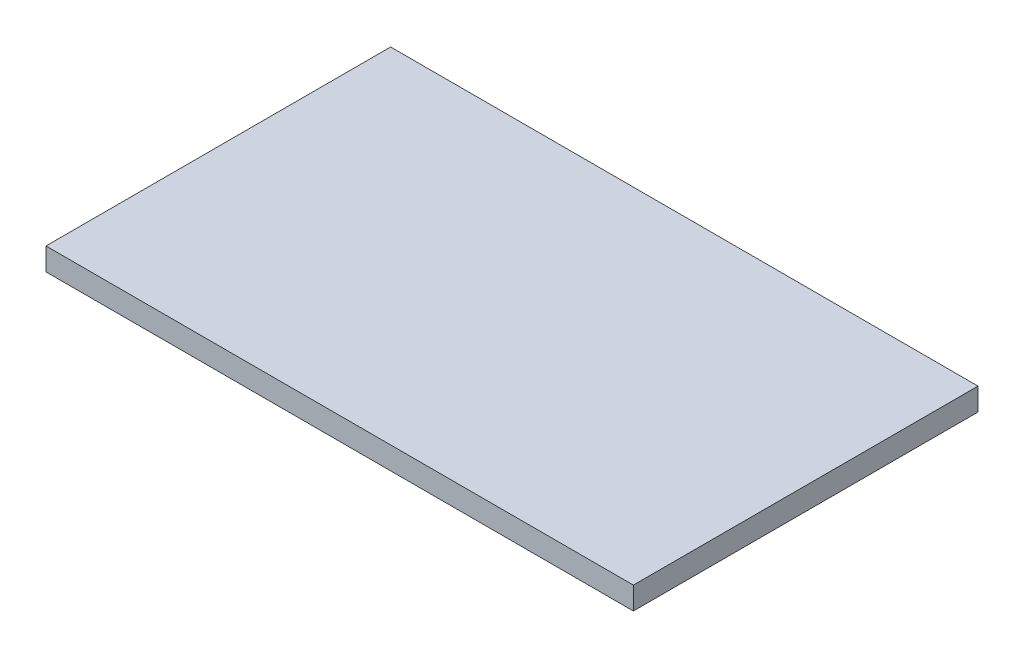
ISO-10303-21;
HEADER;
FILE_DESCRIPTION(('STEP AP214'),'2;1');
FILE_NAME('part.step','',(''),(''),'','','');
FILE_SCHEMA(('AUTOMOTIVE_DESIGN { 1 0 10303 214 1 1 1 1 }'));
ENDSEC;
DATA;
#1=APPLICATION_CONTEXT('core data for automotive mechanical design processes');
#2=APPLICATION_PROTOCOL_DEFINITION('international standard','automotive_design',2000,#1);
#3=PRODUCT_CONTEXT('',#1,'mechanical');
#4=PRODUCT('Part','Part','',(#3));
#5=PRODUCT_RELATED_PRODUCT_CATEGORY('part','',(#4));
#6=PRODUCT_DEFINITION_FORMATION('','',#4);
#7=PRODUCT_DEFINITION_CONTEXT('part definition',#1,'design');
#8=PRODUCT_DEFINITION('design','',#6,#7);
#9=PRODUCT_DEFINITION_SHAPE('','',#8);
#10=(LENGTH_UNIT() NAMED_UNIT(*) SI_UNIT(.MILLI.,.METRE.));
#11=(NAMED_UNIT(*) PLANE_ANGLE_UNIT() SI_UNIT($,.RADIAN.));
#12=(NAMED_UNIT(*) SI_UNIT($,.STERADIAN.) SOLID_ANGLE_UNIT());
#13=UNCERTAINTY_MEASURE_WITH_UNIT(LENGTH_MEASURE(1.E-05),#10,'distance_accuracy_value','');
#14=(GEOMETRIC_REPRESENTATION_CONTEXT(3) GLOBAL_UNCERTAINTY_ASSIGNED_CONTEXT((#13)) GLOBAL_UNIT_ASSIGNED_CONTEXT((#10,
#11,#12)) REPRESENTATION_CONTEXT('',''));
#15=CARTESIAN_POINT('',(0.,0.,0.));
#16=DIRECTION('',(0.,0.,1.));
#17=DIRECTION('',(1.,0.,0.));
#18=AXIS2_PLACEMENT_3D('',#15,#16,#17);
#19=CARTESIAN_POINT('',(39.2,3.,-23.));
#20=DIRECTION('',(-1.,0.,0.));
#21=DIRECTION('',(0.,0.,1.));
#22=AXIS2_PLACEMENT_3D('',#19,#20,#21);
#23=PLANE('',#22);
#24=DIRECTION('',(0.,0.,-1.));
#25=VECTOR('',#24,1.);
#26=CARTESIAN_POINT('',(39.2,0.,-23.));
#27=LINE('',#26,#25);
#28=CARTESIAN_POINT('',(39.2,0.,23.));
#29=VERTEX_POINT('',#28);
#30=CARTESIAN_POINT('',(39.2,0.,-23.));
#31=VERTEX_POINT('',#30);
#32=EDGE_CURVE('E95',#29,#31,#27,.T.);
#33=ORIENTED_EDGE('',*,*,#32,.T.);
#34=DIRECTION('',(0.,-1.,0.));
#35=VECTOR('',#34,1.);
#36=CARTESIAN_POINT('',(39.2,3.,-23.));
#37=LINE('',#36,#35);
#38=CARTESIAN_POINT('',(39.2,3.,-23.));
#39=VERTEX_POINT('',#38);
#40=EDGE_CURVE('E11',#39,#31,#37,.T.);
#41=ORIENTED_EDGE('',*,*,#40,.F.);
#42=DIRECTION('',(0.,0.,-1.));
#43=VECTOR('',#42,1.);
#44=CARTESIAN_POINT('',(39.2,3.,-23.));
#45=LINE('',#44,#43);
#46=CARTESIAN_POINT('',(39.2,3.,23.));
#47=VERTEX_POINT('',#46);
#48=EDGE_CURVE('E83',#47,#39,#45,.T.);
#49=ORIENTED_EDGE('',*,*,#48,.F.);
#50=DIRECTION('',(0.,-1.,0.));
#51=VECTOR('',#50,1.);
#52=CARTESIAN_POINT('',(39.2,3.,23.));
#53=LINE('',#52,#51);
#54=EDGE_CURVE('E91',#47,#29,#53,.T.);
#55=ORIENTED_EDGE('',*,*,#54,.T.);
#56=EDGE_LOOP('',(#33,#41,#49,#55));
#57=FACE_BOUND('',#56,.T.);
#58=ADVANCED_FACE('F32',(#57),#23,.F.);
#59=CARTESIAN_POINT('',(-39.2,3.,-23.));
#60=DIRECTION('',(0.,0.,1.));
#61=DIRECTION('',(1.,0.,0.));
#62=AXIS2_PLACEMENT_3D('',#59,#60,#61);
#63=PLANE('',#62);
#64=DIRECTION('',(-1.,0.,0.));
#65=VECTOR('',#64,1.);
#66=CARTESIAN_POINT('',(-39.2,0.,-23.));
#67=LINE('',#66,#65);
#68=CARTESIAN_POINT('',(-39.2,0.,-23.));
#69=VERTEX_POINT('',#68);
#70=EDGE_CURVE('E87',#31,#69,#67,.T.);
#71=ORIENTED_EDGE('',*,*,#70,.T.);
#72=DIRECTION('',(0.,-1.,0.));
#73=VECTOR('',#72,1.);
#74=CARTESIAN_POINT('',(-39.2,3.,-23.));
#75=LINE('',#74,#73);
#76=CARTESIAN_POINT('',(-39.2,3.,-23.));
#77=VERTEX_POINT('',#76);
#78=EDGE_CURVE('E40',#77,#69,#75,.T.);
#79=ORIENTED_EDGE('',*,*,#78,.F.);
#80=DIRECTION('',(-1.,0.,0.));
#81=VECTOR('',#80,1.);
#82=CARTESIAN_POINT('',(-39.2,3.,-23.));
#83=LINE('',#82,#81);
#84=EDGE_CURVE('E78',#39,#77,#83,.T.);
#85=ORIENTED_EDGE('',*,*,#84,.F.);
#86=ORIENTED_EDGE('',*,*,#40,.T.);
#87=EDGE_LOOP('',(#71,#79,#85,#86));
#88=FACE_BOUND('',#87,.T.);
#89=ADVANCED_FACE('F86',(#88),#63,.F.);
#90=CARTESIAN_POINT('',(-39.2,3.,-23.));
#91=DIRECTION('',(1.,0.,0.));
#92=DIRECTION('',(0.,0.,-1.));
#93=AXIS2_PLACEMENT_3D('',#90,#91,#92);
#94=PLANE('',#93);
#95=DIRECTION('',(0.,0.,1.));
#96=VECTOR('',#95,1.);
#97=CARTESIAN_POINT('',(-39.2,0.,-23.));
#98=LINE('',#97,#96);
#99=CARTESIAN_POINT('',(-39.2,0.,23.));
#100=VERTEX_POINT('',#99);
#101=EDGE_CURVE('E65',#69,#100,#98,.T.);
#102=ORIENTED_EDGE('',*,*,#101,.T.);
#103=DIRECTION('',(0.,-1.,0.));
#104=VECTOR('',#103,1.);
#105=CARTESIAN_POINT('',(-39.2,3.,23.));
#106=LINE('',#105,#104);
#107=CARTESIAN_POINT('',(-39.2,3.,23.));
#108=VERTEX_POINT('',#107);
#109=EDGE_CURVE('E88',#108,#100,#106,.T.);
#110=ORIENTED_EDGE('',*,*,#109,.F.);
#111=DIRECTION('',(0.,0.,1.));
#112=VECTOR('',#111,1.);
#113=CARTESIAN_POINT('',(-39.2,3.,-23.));
#114=LINE('',#113,#112);
#115=EDGE_CURVE('E81',#77,#108,#114,.T.);
#116=ORIENTED_EDGE('',*,*,#115,.F.);
#117=ORIENTED_EDGE('',*,*,#78,.T.);
#118=EDGE_LOOP('',(#102,#110,#116,#117));
#119=FACE_BOUND('',#118,.T.);
#120=ADVANCED_FACE('F89',(#119),#94,.F.);
#121=CARTESIAN_POINT('',(-39.2,3.,23.));
#122=DIRECTION('',(0.,0.,-1.));
#123=DIRECTION('',(-1.,0.,0.));
#124=AXIS2_PLACEMENT_3D('',#121,#122,#123);
#125=PLANE('',#124);
#126=DIRECTION('',(1.,0.,0.));
#127=VECTOR('',#126,1.);
#128=CARTESIAN_POINT('',(-39.2,0.,23.));
#129=LINE('',#128,#127);
#130=EDGE_CURVE('E71',#100,#29,#129,.T.);
#131=ORIENTED_EDGE('',*,*,#130,.T.);
#132=ORIENTED_EDGE('',*,*,#54,.F.);
#133=DIRECTION('',(1.,0.,0.));
#134=VECTOR('',#133,1.);
#135=CARTESIAN_POINT('',(-39.2,3.,23.));
#136=LINE('',#135,#134);
#137=EDGE_CURVE('E48',#108,#47,#136,.T.);
#138=ORIENTED_EDGE('',*,*,#137,.F.);
#139=ORIENTED_EDGE('',*,*,#109,.T.);
#140=EDGE_LOOP('',(#131,#132,#138,#139));
#141=FACE_BOUND('',#140,.T.);
#142=ADVANCED_FACE('F102',(#141),#125,.F.);
#143=CARTESIAN_POINT('',(0.,3.,0.));
#144=DIRECTION('',(0.,1.,0.));
#145=DIRECTION('',(0.,0.,1.));
#146=AXIS2_PLACEMENT_3D('',#143,#144,#145);
#147=PLANE('',#146);
#148=ORIENTED_EDGE('',*,*,#48,.T.);
#149=ORIENTED_EDGE('',*,*,#84,.T.);
#150=ORIENTED_EDGE('',*,*,#115,.T.);
#151=ORIENTED_EDGE('',*,*,#137,.T.);
#152=EDGE_LOOP('',(#148,#149,#150,#151));
#153=FACE_BOUND('',#152,.T.);
#154=ADVANCED_FACE('F79',(#153),#147,.T.);
#155=CARTESIAN_POINT('',(0.,0.,0.));
#156=DIRECTION('',(0.,1.,0.));
#157=DIRECTION('',(0.,0.,1.));
#158=AXIS2_PLACEMENT_3D('',#155,#156,#157);
#159=PLANE('',#158);
#160=ORIENTED_EDGE('',*,*,#32,.F.);
#161=ORIENTED_EDGE('',*,*,#130,.F.);
#162=ORIENTED_EDGE('',*,*,#101,.F.);
#163=ORIENTED_EDGE('',*,*,#70,.F.);
#164=EDGE_LOOP('',(#160,#161,#162,#163));
#165=FACE_BOUND('',#164,.T.);
#166=ADVANCED_FACE('F105',(#165),#159,.F.);
#167=CLOSED_SHELL('',(#58,#89,#120,#142,#154,#166));
#168=MANIFOLD_SOLID_BREP('B2',#167);
#169=ADVANCED_BREP_SHAPE_REPRESENTATION('',(#18,#168),#14);
#170=SHAPE_DEFINITION_REPRESENTATION(#9,#169);
ENDSEC;
END-ISO-10303-21;
